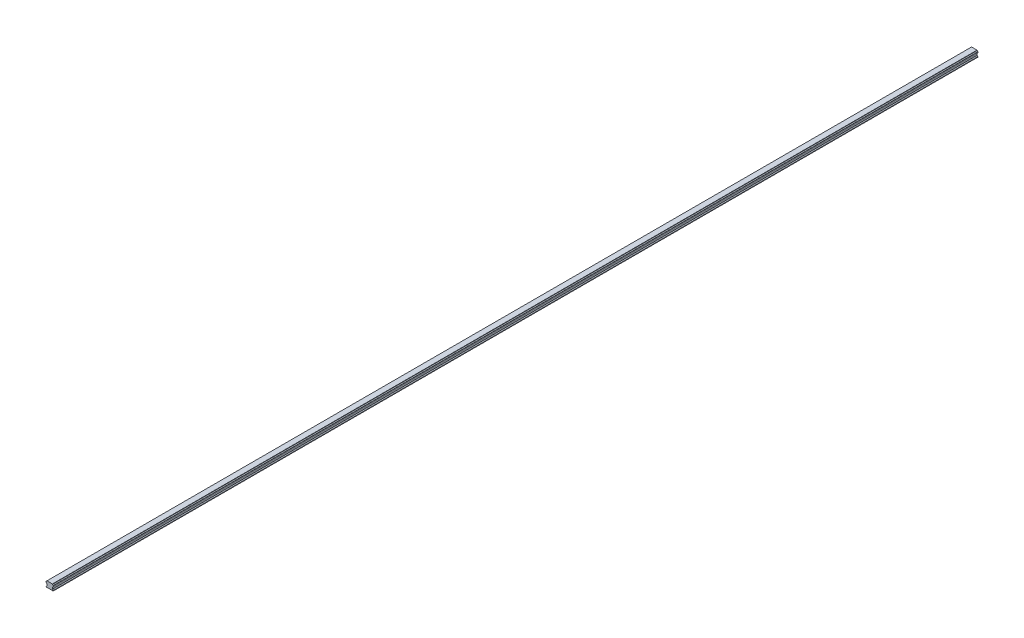
ISO-10303-21;
HEADER;
FILE_DESCRIPTION(('STEP AP214'),'2;1');
FILE_NAME('part.step','',(''),(''),'','','');
FILE_SCHEMA(('AUTOMOTIVE_DESIGN { 1 0 10303 214 1 1 1 1 }'));
ENDSEC;
DATA;
#1=APPLICATION_CONTEXT('core data for automotive mechanical design processes');
#2=APPLICATION_PROTOCOL_DEFINITION('international standard','automotive_design',2000,#1);
#3=PRODUCT_CONTEXT('',#1,'mechanical');
#4=PRODUCT('Part','Part','',(#3));
#5=PRODUCT_RELATED_PRODUCT_CATEGORY('part','',(#4));
#6=PRODUCT_DEFINITION_FORMATION('','',#4);
#7=PRODUCT_DEFINITION_CONTEXT('part definition',#1,'design');
#8=PRODUCT_DEFINITION('design','',#6,#7);
#9=PRODUCT_DEFINITION_SHAPE('','',#8);
#10=(LENGTH_UNIT() NAMED_UNIT(*) SI_UNIT(.MILLI.,.METRE.));
#11=(NAMED_UNIT(*) PLANE_ANGLE_UNIT() SI_UNIT($,.RADIAN.));
#12=(NAMED_UNIT(*) SI_UNIT($,.STERADIAN.) SOLID_ANGLE_UNIT());
#13=UNCERTAINTY_MEASURE_WITH_UNIT(LENGTH_MEASURE(1.E-05),#10,'distance_accuracy_value','');
#14=(GEOMETRIC_REPRESENTATION_CONTEXT(3) GLOBAL_UNCERTAINTY_ASSIGNED_CONTEXT((#13)) GLOBAL_UNIT_ASSIGNED_CONTEXT((#10,
#11,#12)) REPRESENTATION_CONTEXT('',''));
#15=CARTESIAN_POINT('',(0.,0.,0.));
#16=DIRECTION('',(0.,0.,1.));
#17=DIRECTION('',(1.,0.,0.));
#18=AXIS2_PLACEMENT_3D('',#15,#16,#17);
#19=CARTESIAN_POINT('',(12.6061123393257,-8.53589954229437,2900.));
#20=DIRECTION('',(0.,0.,-1.));
#21=DIRECTION('',(-1.,0.,0.));
#22=AXIS2_PLACEMENT_3D('',#19,#20,#21);
#23=CYLINDRICAL_SURFACE('',#22,2.52146686901217);
#24=CARTESIAN_POINT('',(12.6061123393257,-8.53589954229437,0.));
#25=DIRECTION('',(0.,0.,1.));
#26=DIRECTION('',(1.,0.,0.));
#27=AXIS2_PLACEMENT_3D('',#24,#25,#26);
#28=CIRCLE('',#27,2.52146686901217);
#29=CARTESIAN_POINT('',(12.4098510861146,-6.02208238664959,0.));
#30=VERTEX_POINT('',#29);
#31=CARTESIAN_POINT('',(10.0922951836809,-8.33963828908326,0.));
#32=VERTEX_POINT('',#31);
#33=EDGE_CURVE('E211',#30,#32,#28,.T.);
#34=ORIENTED_EDGE('',*,*,#33,.F.);
#35=DIRECTION('',(0.,0.,-1.));
#36=VECTOR('',#35,1.);
#37=CARTESIAN_POINT('',(12.4098510861146,-6.02208238664959,2900.));
#38=LINE('',#37,#36);
#39=CARTESIAN_POINT('',(12.4098510861146,-6.02208238664959,2900.));
#40=VERTEX_POINT('',#39);
#41=EDGE_CURVE('E11',#40,#30,#38,.T.);
#42=ORIENTED_EDGE('',*,*,#41,.F.);
#43=CARTESIAN_POINT('',(12.6061123393257,-8.53589954229437,2900.));
#44=DIRECTION('',(0.,0.,1.));
#45=DIRECTION('',(1.,0.,0.));
#46=AXIS2_PLACEMENT_3D('',#43,#44,#45);
#47=CIRCLE('',#46,2.52146686901217);
#48=CARTESIAN_POINT('',(10.0922951836809,-8.33963828908326,2900.));
#49=VERTEX_POINT('',#48);
#50=EDGE_CURVE('E271',#40,#49,#47,.T.);
#51=ORIENTED_EDGE('',*,*,#50,.T.);
#52=DIRECTION('',(0.,0.,-1.));
#53=VECTOR('',#52,1.);
#54=CARTESIAN_POINT('',(10.0922951836809,-8.33963828908326,2900.));
#55=LINE('',#54,#53);
#56=EDGE_CURVE('E51',#49,#32,#55,.T.);
#57=ORIENTED_EDGE('',*,*,#56,.T.);
#58=EDGE_LOOP('',(#34,#42,#51,#57));
#59=FACE_BOUND('',#58,.T.);
#60=ADVANCED_FACE('F35',(#59),#23,.F.);
#61=CARTESIAN_POINT('',(9.21596673638211,-9.21596673638211,2900.));
#62=DIRECTION('',(0.707106781186548,-0.707106781186548,0.));
#63=DIRECTION('',(0.707106781186548,0.707106781186548,0.));
#64=AXIS2_PLACEMENT_3D('',#61,#62,#63);
#65=PLANE('',#64);
#66=DIRECTION('',(-0.707106781186548,-0.707106781186548,0.));
#67=VECTOR('',#66,1.);
#68=CARTESIAN_POINT('',(9.21596673638211,-9.21596673638211,0.));
#69=LINE('',#68,#67);
#70=CARTESIAN_POINT('',(12.6061123393258,-5.82582113343842,0.));
#71=VERTEX_POINT('',#70);
#72=EDGE_CURVE('E213',#71,#30,#69,.T.);
#73=ORIENTED_EDGE('',*,*,#72,.F.);
#74=DIRECTION('',(0.,0.,-1.));
#75=VECTOR('',#74,1.);
#76=CARTESIAN_POINT('',(12.6061123393258,-5.82582113343842,2900.));
#77=LINE('',#76,#75);
#78=CARTESIAN_POINT('',(12.6061123393258,-5.82582113343842,2900.));
#79=VERTEX_POINT('',#78);
#80=EDGE_CURVE('E43',#79,#71,#77,.T.);
#81=ORIENTED_EDGE('',*,*,#80,.F.);
#82=DIRECTION('',(-0.707106781186548,-0.707106781186548,0.));
#83=VECTOR('',#82,1.);
#84=CARTESIAN_POINT('',(9.21596673638211,-9.21596673638211,2900.));
#85=LINE('',#84,#83);
#86=EDGE_CURVE('E330',#79,#40,#85,.T.);
#87=ORIENTED_EDGE('',*,*,#86,.T.);
#88=ORIENTED_EDGE('',*,*,#41,.T.);
#89=EDGE_LOOP('',(#73,#81,#87,#88));
#90=FACE_BOUND('',#89,.T.);
#91=ADVANCED_FACE('F318',(#90),#65,.T.);
#92=CARTESIAN_POINT('',(12.6061123393258,0.,2900.));
#93=DIRECTION('',(1.,0.,0.));
#94=DIRECTION('',(0.,0.,-1.));
#95=AXIS2_PLACEMENT_3D('',#92,#93,#94);
#96=PLANE('',#95);
#97=DIRECTION('',(0.,-1.,0.));
#98=VECTOR('',#97,1.);
#99=CARTESIAN_POINT('',(12.6061123393258,0.,0.));
#100=LINE('',#99,#98);
#101=CARTESIAN_POINT('',(12.6061123393258,-2.80006089062388,0.));
#102=VERTEX_POINT('',#101);
#103=EDGE_CURVE('E216',#102,#71,#100,.T.);
#104=ORIENTED_EDGE('',*,*,#103,.F.);
#105=DIRECTION('',(0.,0.,-1.));
#106=VECTOR('',#105,1.);
#107=CARTESIAN_POINT('',(12.6061123393258,-2.80006089062388,2900.));
#108=LINE('',#107,#106);
#109=CARTESIAN_POINT('',(12.6061123393258,-2.80006089062388,2900.));
#110=VERTEX_POINT('',#109);
#111=EDGE_CURVE('E307',#110,#102,#108,.T.);
#112=ORIENTED_EDGE('',*,*,#111,.F.);
#113=DIRECTION('',(0.,-1.,0.));
#114=VECTOR('',#113,1.);
#115=CARTESIAN_POINT('',(12.6061123393258,0.,2900.));
#116=LINE('',#115,#114);
#117=EDGE_CURVE('E314',#110,#79,#116,.T.);
#118=ORIENTED_EDGE('',*,*,#117,.T.);
#119=ORIENTED_EDGE('',*,*,#80,.T.);
#120=EDGE_LOOP('',(#104,#112,#118,#119));
#121=FACE_BOUND('',#120,.T.);
#122=ADVANCED_FACE('F312',(#121),#96,.T.);
#123=CARTESIAN_POINT('',(4.90302572435094,4.90302572435095,2900.));
#124=DIRECTION('',(0.707106781186547,0.707106781186548,0.));
#125=DIRECTION('',(-0.707106781186548,0.707106781186547,0.));
#126=AXIS2_PLACEMENT_3D('',#123,#124,#125);
#127=PLANE('',#126);
#128=DIRECTION('',(0.707106781186548,-0.707106781186547,0.));
#129=VECTOR('',#128,1.);
#130=CARTESIAN_POINT('',(4.90302572435094,4.90302572435095,0.));
#131=LINE('',#130,#129);
#132=CARTESIAN_POINT('',(12.4098510861147,-2.60379963741275,0.));
#133=VERTEX_POINT('',#132);
#134=EDGE_CURVE('E219',#133,#102,#131,.T.);
#135=ORIENTED_EDGE('',*,*,#134,.F.);
#136=DIRECTION('',(0.,0.,-1.));
#137=VECTOR('',#136,1.);
#138=CARTESIAN_POINT('',(12.4098510861147,-2.60379963741275,2900.));
#139=LINE('',#138,#137);
#140=CARTESIAN_POINT('',(12.4098510861147,-2.60379963741275,2900.));
#141=VERTEX_POINT('',#140);
#142=EDGE_CURVE('E305',#141,#133,#139,.T.);
#143=ORIENTED_EDGE('',*,*,#142,.F.);
#144=DIRECTION('',(0.707106781186548,-0.707106781186547,0.));
#145=VECTOR('',#144,1.);
#146=CARTESIAN_POINT('',(4.90302572435094,4.90302572435095,2900.));
#147=LINE('',#146,#145);
#148=EDGE_CURVE('E327',#141,#110,#147,.T.);
#149=ORIENTED_EDGE('',*,*,#148,.T.);
#150=ORIENTED_EDGE('',*,*,#111,.T.);
#151=EDGE_LOOP('',(#135,#143,#149,#150));
#152=FACE_BOUND('',#151,.T.);
#153=ADVANCED_FACE('F324',(#152),#127,.T.);
#154=CARTESIAN_POINT('',(12.6061123393258,-0.0899824817679875,2900.));
#155=DIRECTION('',(0.,0.,-1.));
#156=DIRECTION('',(-1.,0.,0.));
#157=AXIS2_PLACEMENT_3D('',#154,#155,#156);
#158=CYLINDRICAL_SURFACE('',#157,2.52146686901215);
#159=CARTESIAN_POINT('',(12.6061123393258,-0.0899824817679875,0.));
#160=DIRECTION('',(0.,0.,1.));
#161=DIRECTION('',(1.,0.,0.));
#162=AXIS2_PLACEMENT_3D('',#159,#160,#161);
#163=CIRCLE('',#162,2.52146686901215);
#164=CARTESIAN_POINT('',(10.092295183681,-0.286243734979242,0.));
#165=VERTEX_POINT('',#164);
#166=EDGE_CURVE('E222',#165,#133,#163,.T.);
#167=ORIENTED_EDGE('',*,*,#166,.F.);
#168=DIRECTION('',(0.,0.,-1.));
#169=VECTOR('',#168,1.);
#170=CARTESIAN_POINT('',(10.092295183681,-0.286243734979242,2900.));
#171=LINE('',#170,#169);
#172=CARTESIAN_POINT('',(10.092295183681,-0.286243734979242,2900.));
#173=VERTEX_POINT('',#172);
#174=EDGE_CURVE('E303',#173,#165,#171,.T.);
#175=ORIENTED_EDGE('',*,*,#174,.F.);
#176=CARTESIAN_POINT('',(12.6061123393258,-0.0899824817679875,2900.));
#177=DIRECTION('',(0.,0.,1.));
#178=DIRECTION('',(1.,0.,0.));
#179=AXIS2_PLACEMENT_3D('',#176,#177,#178);
#180=CIRCLE('',#179,2.52146686901215);
#181=EDGE_CURVE('E332',#173,#141,#180,.T.);
#182=ORIENTED_EDGE('',*,*,#181,.T.);
#183=ORIENTED_EDGE('',*,*,#142,.T.);
#184=EDGE_LOOP('',(#167,#175,#182,#183));
#185=FACE_BOUND('',#184,.T.);
#186=ADVANCED_FACE('F406',(#185),#158,.F.);
#187=CARTESIAN_POINT('',(4.90302572435088,4.9030257243509,2900.));
#188=DIRECTION('',(0.707106781186547,0.707106781186548,0.));
#189=DIRECTION('',(-0.707106781186548,0.707106781186547,0.));
#190=AXIS2_PLACEMENT_3D('',#187,#188,#189);
#191=PLANE('',#190);
#192=DIRECTION('',(0.707106781186548,-0.707106781186547,0.));
#193=VECTOR('',#192,1.);
#194=CARTESIAN_POINT('',(4.90302572435088,4.9030257243509,0.));
#195=LINE('',#194,#193);
#196=CARTESIAN_POINT('',(9.58035209651141,0.225699352190385,0.));
#197=VERTEX_POINT('',#196);
#198=EDGE_CURVE('E225',#197,#165,#195,.T.);
#199=ORIENTED_EDGE('',*,*,#198,.F.);
#200=DIRECTION('',(0.,0.,-1.));
#201=VECTOR('',#200,1.);
#202=CARTESIAN_POINT('',(9.58035209651141,0.225699352190385,2900.));
#203=LINE('',#202,#201);
#204=CARTESIAN_POINT('',(9.58035209651141,0.225699352190385,2900.));
#205=VERTEX_POINT('',#204);
#206=EDGE_CURVE('E301',#205,#197,#203,.T.);
#207=ORIENTED_EDGE('',*,*,#206,.F.);
#208=DIRECTION('',(0.707106781186548,-0.707106781186547,0.));
#209=VECTOR('',#208,1.);
#210=CARTESIAN_POINT('',(4.90302572435088,4.9030257243509,2900.));
#211=LINE('',#210,#209);
#212=EDGE_CURVE('E338',#205,#173,#211,.T.);
#213=ORIENTED_EDGE('',*,*,#212,.T.);
#214=ORIENTED_EDGE('',*,*,#174,.T.);
#215=EDGE_LOOP('',(#199,#207,#213,#214));
#216=FACE_BOUND('',#215,.T.);
#217=ADVANCED_FACE('F409',(#216),#191,.T.);
#218=CARTESIAN_POINT('',(0.,0.225699352190385,2900.));
#219=DIRECTION('',(0.,1.,0.));
#220=DIRECTION('',(0.,0.,1.));
#221=AXIS2_PLACEMENT_3D('',#218,#219,#220);
#222=PLANE('',#221);
#223=DIRECTION('',(1.,0.,0.));
#224=VECTOR('',#223,1.);
#225=CARTESIAN_POINT('',(0.,0.225699352190385,0.));
#226=LINE('',#225,#224);
#227=CARTESIAN_POINT('',(-7.56562261277197,0.225699352190385,0.));
#228=VERTEX_POINT('',#227);
#229=EDGE_CURVE('E228',#228,#197,#226,.T.);
#230=ORIENTED_EDGE('',*,*,#229,.F.);
#231=DIRECTION('',(0.,0.,-1.));
#232=VECTOR('',#231,1.);
#233=CARTESIAN_POINT('',(-7.56562261277197,0.225699352190385,2900.));
#234=LINE('',#233,#232);
#235=CARTESIAN_POINT('',(-7.56562261277197,0.225699352190385,2900.));
#236=VERTEX_POINT('',#235);
#237=EDGE_CURVE('E299',#236,#228,#234,.T.);
#238=ORIENTED_EDGE('',*,*,#237,.F.);
#239=DIRECTION('',(1.,0.,0.));
#240=VECTOR('',#239,1.);
#241=CARTESIAN_POINT('',(0.,0.225699352190385,2900.));
#242=LINE('',#241,#240);
#243=EDGE_CURVE('E341',#236,#205,#242,.T.);
#244=ORIENTED_EDGE('',*,*,#243,.T.);
#245=ORIENTED_EDGE('',*,*,#206,.T.);
#246=EDGE_LOOP('',(#230,#238,#244,#245));
#247=FACE_BOUND('',#246,.T.);
#248=ADVANCED_FACE('F413',(#247),#222,.T.);
#249=CARTESIAN_POINT('',(-3.8956609824812,3.89566098248118,2900.));
#250=DIRECTION('',(-0.70710678118655,0.707106781186546,0.));
#251=DIRECTION('',(-0.707106781186546,-0.70710678118655,0.));
#252=AXIS2_PLACEMENT_3D('',#249,#250,#251);
#253=PLANE('',#252);
#254=DIRECTION('',(0.707106781186546,0.707106781186549,0.));
#255=VECTOR('',#254,1.);
#256=CARTESIAN_POINT('',(-3.8956609824812,3.89566098248118,0.));
#257=LINE('',#256,#255);
#258=CARTESIAN_POINT('',(-8.07756569994197,-0.28624373497962,0.));
#259=VERTEX_POINT('',#258);
#260=EDGE_CURVE('E231',#259,#228,#257,.T.);
#261=ORIENTED_EDGE('',*,*,#260,.F.);
#262=DIRECTION('',(0.,0.,-1.));
#263=VECTOR('',#262,1.);
#264=CARTESIAN_POINT('',(-8.07756569994197,-0.28624373497962,2900.));
#265=LINE('',#264,#263);
#266=CARTESIAN_POINT('',(-8.07756569994197,-0.28624373497962,2900.));
#267=VERTEX_POINT('',#266);
#268=EDGE_CURVE('E297',#267,#259,#265,.T.);
#269=ORIENTED_EDGE('',*,*,#268,.F.);
#270=DIRECTION('',(0.707106781186546,0.707106781186549,0.));
#271=VECTOR('',#270,1.);
#272=CARTESIAN_POINT('',(-3.8956609824812,3.89566098248118,2900.));
#273=LINE('',#272,#271);
#274=EDGE_CURVE('E344',#267,#236,#273,.T.);
#275=ORIENTED_EDGE('',*,*,#274,.T.);
#276=ORIENTED_EDGE('',*,*,#237,.T.);
#277=EDGE_LOOP('',(#261,#269,#275,#276));
#278=FACE_BOUND('',#277,.T.);
#279=ADVANCED_FACE('F417',(#278),#253,.T.);
#280=CARTESIAN_POINT('',(-10.5913828555866,-0.0899824817683164,2900.));
#281=DIRECTION('',(0.,0.,-1.));
#282=DIRECTION('',(-1.,0.,0.));
#283=AXIS2_PLACEMENT_3D('',#280,#281,#282);
#284=CYLINDRICAL_SURFACE('',#283,2.521466869012);
#285=CARTESIAN_POINT('',(-10.5913828555866,-0.0899824817683164,0.));
#286=DIRECTION('',(0.,0.,1.));
#287=DIRECTION('',(1.,0.,0.));
#288=AXIS2_PLACEMENT_3D('',#285,#286,#287);
#289=CIRCLE('',#288,2.521466869012);
#290=CARTESIAN_POINT('',(-10.3951216023756,-2.60379963741295,0.));
#291=VERTEX_POINT('',#290);
#292=EDGE_CURVE('E234',#291,#259,#289,.T.);
#293=ORIENTED_EDGE('',*,*,#292,.F.);
#294=DIRECTION('',(0.,0.,-1.));
#295=VECTOR('',#294,1.);
#296=CARTESIAN_POINT('',(-10.3951216023756,-2.60379963741295,2900.));
#297=LINE('',#296,#295);
#298=CARTESIAN_POINT('',(-10.3951216023756,-2.60379963741295,2900.));
#299=VERTEX_POINT('',#298);
#300=EDGE_CURVE('E295',#299,#291,#297,.T.);
#301=ORIENTED_EDGE('',*,*,#300,.F.);
#302=CARTESIAN_POINT('',(-10.5913828555866,-0.0899824817683164,2900.));
#303=DIRECTION('',(0.,0.,1.));
#304=DIRECTION('',(1.,0.,0.));
#305=AXIS2_PLACEMENT_3D('',#302,#303,#304);
#306=CIRCLE('',#305,2.521466869012);
#307=EDGE_CURVE('E347',#299,#267,#306,.T.);
#308=ORIENTED_EDGE('',*,*,#307,.T.);
#309=ORIENTED_EDGE('',*,*,#268,.T.);
#310=EDGE_LOOP('',(#293,#301,#308,#309));
#311=FACE_BOUND('',#310,.T.);
#312=ADVANCED_FACE('F421',(#311),#284,.F.);
#313=CARTESIAN_POINT('',(-3.89566098248133,3.89566098248133,2900.));
#314=DIRECTION('',(-0.707106781186547,0.707106781186548,0.));
#315=DIRECTION('',(-0.707106781186548,-0.707106781186547,0.));
#316=AXIS2_PLACEMENT_3D('',#313,#314,#315);
#317=PLANE('',#316);
#318=DIRECTION('',(0.707106781186548,0.707106781186547,0.));
#319=VECTOR('',#318,1.);
#320=CARTESIAN_POINT('',(-3.89566098248133,3.89566098248133,0.));
#321=LINE('',#320,#319);
#322=CARTESIAN_POINT('',(-10.5913828555866,-2.8000608906239,0.));
#323=VERTEX_POINT('',#322);
#324=EDGE_CURVE('E237',#323,#291,#321,.T.);
#325=ORIENTED_EDGE('',*,*,#324,.F.);
#326=DIRECTION('',(0.,0.,-1.));
#327=VECTOR('',#326,1.);
#328=CARTESIAN_POINT('',(-10.5913828555866,-2.8000608906239,2900.));
#329=LINE('',#328,#327);
#330=CARTESIAN_POINT('',(-10.5913828555866,-2.8000608906239,2900.));
#331=VERTEX_POINT('',#330);
#332=EDGE_CURVE('E293',#331,#323,#329,.T.);
#333=ORIENTED_EDGE('',*,*,#332,.F.);
#334=DIRECTION('',(0.707106781186548,0.707106781186547,0.));
#335=VECTOR('',#334,1.);
#336=CARTESIAN_POINT('',(-3.89566098248133,3.89566098248133,2900.));
#337=LINE('',#336,#335);
#338=EDGE_CURVE('E350',#331,#299,#337,.T.);
#339=ORIENTED_EDGE('',*,*,#338,.T.);
#340=ORIENTED_EDGE('',*,*,#300,.T.);
#341=EDGE_LOOP('',(#325,#333,#339,#340));
#342=FACE_BOUND('',#341,.T.);
#343=ADVANCED_FACE('F425',(#342),#317,.T.);
#344=CARTESIAN_POINT('',(-10.5913828555866,0.,2900.));
#345=DIRECTION('',(-1.,0.,0.));
#346=DIRECTION('',(0.,0.,1.));
#347=AXIS2_PLACEMENT_3D('',#344,#345,#346);
#348=PLANE('',#347);
#349=DIRECTION('',(0.,1.,0.));
#350=VECTOR('',#349,1.);
#351=CARTESIAN_POINT('',(-10.5913828555866,0.,0.));
#352=LINE('',#351,#350);
#353=CARTESIAN_POINT('',(-10.5913828555866,-5.82582113343851,0.));
#354=VERTEX_POINT('',#353);
#355=EDGE_CURVE('E240',#354,#323,#352,.T.);
#356=ORIENTED_EDGE('',*,*,#355,.F.);
#357=DIRECTION('',(0.,0.,-1.));
#358=VECTOR('',#357,1.);
#359=CARTESIAN_POINT('',(-10.5913828555866,-5.82582113343851,2900.));
#360=LINE('',#359,#358);
#361=CARTESIAN_POINT('',(-10.5913828555866,-5.82582113343851,2900.));
#362=VERTEX_POINT('',#361);
#363=EDGE_CURVE('E291',#362,#354,#360,.T.);
#364=ORIENTED_EDGE('',*,*,#363,.F.);
#365=DIRECTION('',(0.,1.,0.));
#366=VECTOR('',#365,1.);
#367=CARTESIAN_POINT('',(-10.5913828555866,0.,2900.));
#368=LINE('',#367,#366);
#369=EDGE_CURVE('E353',#362,#331,#368,.T.);
#370=ORIENTED_EDGE('',*,*,#369,.T.);
#371=ORIENTED_EDGE('',*,*,#332,.T.);
#372=EDGE_LOOP('',(#356,#364,#370,#371));
#373=FACE_BOUND('',#372,.T.);
#374=ADVANCED_FACE('F429',(#373),#348,.T.);
#375=CARTESIAN_POINT('',(-8.20860199451251,-8.20860199451255,2900.));
#376=DIRECTION('',(-0.707106781186546,-0.707106781186549,0.));
#377=DIRECTION('',(0.707106781186549,-0.707106781186546,0.));
#378=AXIS2_PLACEMENT_3D('',#375,#376,#377);
#379=PLANE('',#378);
#380=DIRECTION('',(-0.707106781186549,0.707106781186546,0.));
#381=VECTOR('',#380,1.);
#382=CARTESIAN_POINT('',(-8.20860199451251,-8.20860199451255,0.));
#383=LINE('',#382,#381);
#384=CARTESIAN_POINT('',(-10.3951216023755,-6.02208238664962,0.));
#385=VERTEX_POINT('',#384);
#386=EDGE_CURVE('E243',#385,#354,#383,.T.);
#387=ORIENTED_EDGE('',*,*,#386,.F.);
#388=DIRECTION('',(0.,0.,-1.));
#389=VECTOR('',#388,1.);
#390=CARTESIAN_POINT('',(-10.3951216023755,-6.02208238664962,2900.));
#391=LINE('',#390,#389);
#392=CARTESIAN_POINT('',(-10.3951216023755,-6.02208238664962,2900.));
#393=VERTEX_POINT('',#392);
#394=EDGE_CURVE('E289',#393,#385,#391,.T.);
#395=ORIENTED_EDGE('',*,*,#394,.F.);
#396=DIRECTION('',(-0.707106781186549,0.707106781186546,0.));
#397=VECTOR('',#396,1.);
#398=CARTESIAN_POINT('',(-8.20860199451251,-8.20860199451255,2900.));
#399=LINE('',#398,#397);
#400=EDGE_CURVE('E356',#393,#362,#399,.T.);
#401=ORIENTED_EDGE('',*,*,#400,.T.);
#402=ORIENTED_EDGE('',*,*,#363,.T.);
#403=EDGE_LOOP('',(#387,#395,#401,#402));
#404=FACE_BOUND('',#403,.T.);
#405=ADVANCED_FACE('F433',(#404),#379,.T.);
#406=CARTESIAN_POINT('',(-10.5913828555866,-8.5358995422944,2900.));
#407=DIRECTION('',(0.,0.,-1.));
#408=DIRECTION('',(-1.,0.,0.));
#409=AXIS2_PLACEMENT_3D('',#406,#407,#408);
#410=CYLINDRICAL_SURFACE('',#409,2.52146686901217);
#411=CARTESIAN_POINT('',(-10.5913828555866,-8.5358995422944,0.));
#412=DIRECTION('',(0.,0.,1.));
#413=DIRECTION('',(1.,0.,0.));
#414=AXIS2_PLACEMENT_3D('',#411,#412,#413);
#415=CIRCLE('',#414,2.52146686901217);
#416=CARTESIAN_POINT('',(-8.07756569994179,-8.33963828908329,0.));
#417=VERTEX_POINT('',#416);
#418=EDGE_CURVE('E246',#417,#385,#415,.T.);
#419=ORIENTED_EDGE('',*,*,#418,.F.);
#420=DIRECTION('',(0.,0.,-1.));
#421=VECTOR('',#420,1.);
#422=CARTESIAN_POINT('',(-8.07756569994179,-8.33963828908329,2900.));
#423=LINE('',#422,#421);
#424=CARTESIAN_POINT('',(-8.07756569994179,-8.33963828908329,2900.));
#425=VERTEX_POINT('',#424);
#426=EDGE_CURVE('E287',#425,#417,#423,.T.);
#427=ORIENTED_EDGE('',*,*,#426,.F.);
#428=CARTESIAN_POINT('',(-10.5913828555866,-8.5358995422944,2900.));
#429=DIRECTION('',(0.,0.,1.));
#430=DIRECTION('',(1.,0.,0.));
#431=AXIS2_PLACEMENT_3D('',#428,#429,#430);
#432=CIRCLE('',#431,2.52146686901217);
#433=EDGE_CURVE('E359',#425,#393,#432,.T.);
#434=ORIENTED_EDGE('',*,*,#433,.T.);
#435=ORIENTED_EDGE('',*,*,#394,.T.);
#436=EDGE_LOOP('',(#419,#427,#434,#435));
#437=FACE_BOUND('',#436,.T.);
#438=ADVANCED_FACE('F437',(#437),#410,.F.);
#439=CARTESIAN_POINT('',(-8.20860199451252,-8.20860199451256,2900.));
#440=DIRECTION('',(-0.707106781186546,-0.707106781186549,0.));
#441=DIRECTION('',(0.707106781186549,-0.707106781186546,0.));
#442=AXIS2_PLACEMENT_3D('',#439,#440,#441);
#443=PLANE('',#442);
#444=DIRECTION('',(-0.707106781186549,0.707106781186546,0.));
#445=VECTOR('',#444,1.);
#446=CARTESIAN_POINT('',(-8.20860199451252,-8.20860199451256,0.));
#447=LINE('',#446,#445);
#448=CARTESIAN_POINT('',(-7.56562261277186,-8.85158137625322,0.));
#449=VERTEX_POINT('',#448);
#450=EDGE_CURVE('E249',#449,#417,#447,.T.);
#451=ORIENTED_EDGE('',*,*,#450,.F.);
#452=DIRECTION('',(0.,0.,-1.));
#453=VECTOR('',#452,1.);
#454=CARTESIAN_POINT('',(-7.56562261277186,-8.85158137625322,2900.));
#455=LINE('',#454,#453);
#456=CARTESIAN_POINT('',(-7.56562261277186,-8.85158137625322,2900.));
#457=VERTEX_POINT('',#456);
#458=EDGE_CURVE('E285',#457,#449,#455,.T.);
#459=ORIENTED_EDGE('',*,*,#458,.F.);
#460=DIRECTION('',(-0.707106781186549,0.707106781186546,0.));
#461=VECTOR('',#460,1.);
#462=CARTESIAN_POINT('',(-8.20860199451252,-8.20860199451256,2900.));
#463=LINE('',#462,#461);
#464=EDGE_CURVE('E362',#457,#425,#463,.T.);
#465=ORIENTED_EDGE('',*,*,#464,.T.);
#466=ORIENTED_EDGE('',*,*,#426,.T.);
#467=EDGE_LOOP('',(#451,#459,#465,#466));
#468=FACE_BOUND('',#467,.T.);
#469=ADVANCED_FACE('F441',(#468),#443,.T.);
#470=CARTESIAN_POINT('',(-7.56562261277186,0.,2900.));
#471=DIRECTION('',(-1.,0.,0.));
#472=DIRECTION('',(0.,0.,1.));
#473=AXIS2_PLACEMENT_3D('',#470,#471,#472);
#474=PLANE('',#473);
#475=DIRECTION('',(0.,1.,0.));
#476=VECTOR('',#475,1.);
#477=CARTESIAN_POINT('',(-7.56562261277186,0.,0.));
#478=LINE('',#477,#476);
#479=CARTESIAN_POINT('',(-7.56562261277186,-13.8945151142775,0.));
#480=VERTEX_POINT('',#479);
#481=EDGE_CURVE('E252',#480,#449,#478,.T.);
#482=ORIENTED_EDGE('',*,*,#481,.F.);
#483=DIRECTION('',(0.,0.,-1.));
#484=VECTOR('',#483,1.);
#485=CARTESIAN_POINT('',(-7.56562261277186,-13.8945151142775,2900.));
#486=LINE('',#485,#484);
#487=CARTESIAN_POINT('',(-7.56562261277186,-13.8945151142775,2900.));
#488=VERTEX_POINT('',#487);
#489=EDGE_CURVE('E283',#488,#480,#486,.T.);
#490=ORIENTED_EDGE('',*,*,#489,.F.);
#491=DIRECTION('',(0.,1.,0.));
#492=VECTOR('',#491,1.);
#493=CARTESIAN_POINT('',(-7.56562261277186,0.,2900.));
#494=LINE('',#493,#492);
#495=EDGE_CURVE('E365',#488,#457,#494,.T.);
#496=ORIENTED_EDGE('',*,*,#495,.T.);
#497=ORIENTED_EDGE('',*,*,#458,.T.);
#498=EDGE_LOOP('',(#482,#490,#496,#497));
#499=FACE_BOUND('',#498,.T.);
#500=ADVANCED_FACE('F445',(#499),#474,.T.);
#501=CARTESIAN_POINT('',(3.16444625075283,-3.16444625075283,2900.));
#502=DIRECTION('',(-0.707106781186547,0.707106781186548,0.));
#503=DIRECTION('',(-0.707106781186548,-0.707106781186547,0.));
#504=AXIS2_PLACEMENT_3D('',#501,#502,#503);
#505=PLANE('',#504);
#506=DIRECTION('',(0.707106781186548,0.707106781186547,0.));
#507=VECTOR('',#506,1.);
#508=CARTESIAN_POINT('',(3.16444625075283,-3.16444625075283,0.));
#509=LINE('',#508,#507);
#510=CARTESIAN_POINT('',(-10.087089481784,-16.4159819832897,0.));
#511=VERTEX_POINT('',#510);
#512=EDGE_CURVE('E255',#511,#480,#509,.T.);
#513=ORIENTED_EDGE('',*,*,#512,.F.);
#514=DIRECTION('',(0.,0.,-1.));
#515=VECTOR('',#514,1.);
#516=CARTESIAN_POINT('',(-10.087089481784,-16.4159819832897,2900.));
#517=LINE('',#516,#515);
#518=CARTESIAN_POINT('',(-10.087089481784,-16.4159819832897,2900.));
#519=VERTEX_POINT('',#518);
#520=EDGE_CURVE('E281',#519,#511,#517,.T.);
#521=ORIENTED_EDGE('',*,*,#520,.F.);
#522=DIRECTION('',(0.707106781186548,0.707106781186547,0.));
#523=VECTOR('',#522,1.);
#524=CARTESIAN_POINT('',(3.16444625075283,-3.16444625075283,2900.));
#525=LINE('',#524,#523);
#526=EDGE_CURVE('E368',#519,#488,#525,.T.);
#527=ORIENTED_EDGE('',*,*,#526,.T.);
#528=ORIENTED_EDGE('',*,*,#489,.T.);
#529=EDGE_LOOP('',(#513,#521,#527,#528));
#530=FACE_BOUND('',#529,.T.);
#531=ADVANCED_FACE('F449',(#530),#505,.T.);
#532=CARTESIAN_POINT('',(-10.087089481784,0.,2900.));
#533=DIRECTION('',(1.,0.,0.));
#534=DIRECTION('',(0.,0.,-1.));
#535=AXIS2_PLACEMENT_3D('',#532,#533,#534);
#536=PLANE('',#535);
#537=DIRECTION('',(0.,-1.,0.));
#538=VECTOR('',#537,1.);
#539=CARTESIAN_POINT('',(-10.087089481784,0.,0.));
#540=LINE('',#539,#538);
#541=CARTESIAN_POINT('',(-10.087089481784,-17.7743006478096,0.));
#542=VERTEX_POINT('',#541);
#543=EDGE_CURVE('E258',#511,#542,#540,.T.);
#544=ORIENTED_EDGE('',*,*,#543,.T.);
#545=DIRECTION('',(0.,0.,-1.));
#546=VECTOR('',#545,1.);
#547=CARTESIAN_POINT('',(-10.087089481784,-17.7743006478096,2900.));
#548=LINE('',#547,#546);
#549=CARTESIAN_POINT('',(-10.087089481784,-17.7743006478096,2900.));
#550=VERTEX_POINT('',#549);
#551=EDGE_CURVE('E278',#550,#542,#548,.T.);
#552=ORIENTED_EDGE('',*,*,#551,.F.);
#553=DIRECTION('',(0.,-1.,0.));
#554=VECTOR('',#553,1.);
#555=CARTESIAN_POINT('',(-10.087089481784,0.,2900.));
#556=LINE('',#555,#554);
#557=EDGE_CURVE('E371',#519,#550,#556,.T.);
#558=ORIENTED_EDGE('',*,*,#557,.F.);
#559=ORIENTED_EDGE('',*,*,#520,.T.);
#560=EDGE_LOOP('',(#544,#552,#558,#559));
#561=FACE_BOUND('',#560,.T.);
#562=ADVANCED_FACE('F453',(#561),#536,.F.);
#563=CARTESIAN_POINT('',(0.,-17.7743006478096,2900.));
#564=DIRECTION('',(0.,1.,0.));
#565=DIRECTION('',(0.,0.,1.));
#566=AXIS2_PLACEMENT_3D('',#563,#564,#565);
#567=PLANE('',#566);
#568=DIRECTION('',(1.,0.,0.));
#569=VECTOR('',#568,1.);
#570=CARTESIAN_POINT('',(0.,-17.7743006478096,0.));
#571=LINE('',#570,#569);
#572=CARTESIAN_POINT('',(12.1018189655234,-17.7743006478096,0.));
#573=VERTEX_POINT('',#572);
#574=EDGE_CURVE('E260',#542,#573,#571,.T.);
#575=ORIENTED_EDGE('',*,*,#574,.T.);
#576=DIRECTION('',(0.,0.,-1.));
#577=VECTOR('',#576,1.);
#578=CARTESIAN_POINT('',(12.1018189655234,-17.7743006478096,2900.));
#579=LINE('',#578,#577);
#580=CARTESIAN_POINT('',(12.1018189655234,-17.7743006478096,2900.));
#581=VERTEX_POINT('',#580);
#582=EDGE_CURVE('E275',#581,#573,#579,.T.);
#583=ORIENTED_EDGE('',*,*,#582,.F.);
#584=DIRECTION('',(1.,0.,0.));
#585=VECTOR('',#584,1.);
#586=CARTESIAN_POINT('',(0.,-17.7743006478096,2900.));
#587=LINE('',#586,#585);
#588=EDGE_CURVE('E373',#550,#581,#587,.T.);
#589=ORIENTED_EDGE('',*,*,#588,.F.);
#590=ORIENTED_EDGE('',*,*,#551,.T.);
#591=EDGE_LOOP('',(#575,#583,#589,#590));
#592=FACE_BOUND('',#591,.T.);
#593=ADVANCED_FACE('F380',(#592),#567,.F.);
#594=CARTESIAN_POINT('',(12.1018189655234,0.,2900.));
#595=DIRECTION('',(-1.,0.,0.));
#596=DIRECTION('',(0.,0.,1.));
#597=AXIS2_PLACEMENT_3D('',#594,#595,#596);
#598=PLANE('',#597);
#599=DIRECTION('',(0.,1.,0.));
#600=VECTOR('',#599,1.);
#601=CARTESIAN_POINT('',(12.1018189655234,0.,0.));
#602=LINE('',#601,#600);
#603=CARTESIAN_POINT('',(12.1018189655234,-16.4159819832895,0.));
#604=VERTEX_POINT('',#603);
#605=EDGE_CURVE('E262',#573,#604,#602,.T.);
#606=ORIENTED_EDGE('',*,*,#605,.T.);
#607=DIRECTION('',(0.,0.,-1.));
#608=VECTOR('',#607,1.);
#609=CARTESIAN_POINT('',(12.1018189655234,-16.4159819832895,2900.));
#610=LINE('',#609,#608);
#611=CARTESIAN_POINT('',(12.1018189655234,-16.4159819832895,2900.));
#612=VERTEX_POINT('',#611);
#613=EDGE_CURVE('E194',#612,#604,#610,.T.);
#614=ORIENTED_EDGE('',*,*,#613,.F.);
#615=DIRECTION('',(0.,1.,0.));
#616=VECTOR('',#615,1.);
#617=CARTESIAN_POINT('',(12.1018189655234,0.,2900.));
#618=LINE('',#617,#616);
#619=EDGE_CURVE('E202',#581,#612,#618,.T.);
#620=ORIENTED_EDGE('',*,*,#619,.F.);
#621=ORIENTED_EDGE('',*,*,#582,.T.);
#622=EDGE_LOOP('',(#606,#614,#620,#621));
#623=FACE_BOUND('',#622,.T.);
#624=ADVANCED_FACE('F384',(#623),#598,.F.);
#625=CARTESIAN_POINT('',(-2.15708150888309,-2.15708150888309,2900.));
#626=DIRECTION('',(0.707106781186548,0.707106781186547,0.));
#627=DIRECTION('',(-0.707106781186547,0.707106781186548,0.));
#628=AXIS2_PLACEMENT_3D('',#625,#626,#627);
#629=PLANE('',#628);
#630=DIRECTION('',(0.707106781186547,-0.707106781186548,0.));
#631=VECTOR('',#630,1.);
#632=CARTESIAN_POINT('',(-2.15708150888309,-2.15708150888309,0.));
#633=LINE('',#632,#631);
#634=CARTESIAN_POINT('',(9.58035209651113,-13.8945151142773,0.));
#635=VERTEX_POINT('',#634);
#636=EDGE_CURVE('E190',#635,#604,#633,.T.);
#637=ORIENTED_EDGE('',*,*,#636,.F.);
#638=DIRECTION('',(0.,0.,-1.));
#639=VECTOR('',#638,1.);
#640=CARTESIAN_POINT('',(9.58035209651113,-13.8945151142773,2900.));
#641=LINE('',#640,#639);
#642=CARTESIAN_POINT('',(9.58035209651113,-13.8945151142773,2900.));
#643=VERTEX_POINT('',#642);
#644=EDGE_CURVE('E185',#643,#635,#641,.T.);
#645=ORIENTED_EDGE('',*,*,#644,.F.);
#646=DIRECTION('',(0.707106781186547,-0.707106781186548,0.));
#647=VECTOR('',#646,1.);
#648=CARTESIAN_POINT('',(-2.15708150888309,-2.15708150888309,2900.));
#649=LINE('',#648,#647);
#650=EDGE_CURVE('E188',#643,#612,#649,.T.);
#651=ORIENTED_EDGE('',*,*,#650,.T.);
#652=ORIENTED_EDGE('',*,*,#613,.T.);
#653=EDGE_LOOP('',(#637,#645,#651,#652));
#654=FACE_BOUND('',#653,.T.);
#655=ADVANCED_FACE('F187',(#654),#629,.T.);
#656=CARTESIAN_POINT('',(9.58035209651113,0.,2900.));
#657=DIRECTION('',(1.,0.,0.));
#658=DIRECTION('',(0.,0.,-1.));
#659=AXIS2_PLACEMENT_3D('',#656,#657,#658);
#660=PLANE('',#659);
#661=DIRECTION('',(0.,-1.,0.));
#662=VECTOR('',#661,1.);
#663=CARTESIAN_POINT('',(9.58035209651113,0.,0.));
#664=LINE('',#663,#662);
#665=CARTESIAN_POINT('',(9.58035209651113,-8.85158137625308,0.));
#666=VERTEX_POINT('',#665);
#667=EDGE_CURVE('E266',#666,#635,#664,.T.);
#668=ORIENTED_EDGE('',*,*,#667,.F.);
#669=DIRECTION('',(0.,0.,-1.));
#670=VECTOR('',#669,1.);
#671=CARTESIAN_POINT('',(9.58035209651113,-8.85158137625308,2900.));
#672=LINE('',#671,#670);
#673=CARTESIAN_POINT('',(9.58035209651113,-8.85158137625308,2900.));
#674=VERTEX_POINT('',#673);
#675=EDGE_CURVE('E118',#674,#666,#672,.T.);
#676=ORIENTED_EDGE('',*,*,#675,.F.);
#677=DIRECTION('',(0.,-1.,0.));
#678=VECTOR('',#677,1.);
#679=CARTESIAN_POINT('',(9.58035209651113,0.,2900.));
#680=LINE('',#679,#678);
#681=EDGE_CURVE('E200',#674,#643,#680,.T.);
#682=ORIENTED_EDGE('',*,*,#681,.T.);
#683=ORIENTED_EDGE('',*,*,#644,.T.);
#684=EDGE_LOOP('',(#668,#676,#682,#683));
#685=FACE_BOUND('',#684,.T.);
#686=ADVANCED_FACE('F205',(#685),#660,.T.);
#687=CARTESIAN_POINT('',(9.21596673638212,-9.21596673638209,2900.));
#688=DIRECTION('',(0.707106781186549,-0.707106781186546,0.));
#689=DIRECTION('',(0.707106781186546,0.707106781186549,0.));
#690=AXIS2_PLACEMENT_3D('',#687,#688,#689);
#691=PLANE('',#690);
#692=DIRECTION('',(-0.707106781186546,-0.707106781186549,0.));
#693=VECTOR('',#692,1.);
#694=CARTESIAN_POINT('',(9.21596673638212,-9.21596673638209,0.));
#695=LINE('',#694,#693);
#696=EDGE_CURVE('E268',#32,#666,#695,.T.);
#697=ORIENTED_EDGE('',*,*,#696,.F.);
#698=ORIENTED_EDGE('',*,*,#56,.F.);
#699=DIRECTION('',(-0.707106781186546,-0.707106781186549,0.));
#700=VECTOR('',#699,1.);
#701=CARTESIAN_POINT('',(9.21596673638212,-9.21596673638209,2900.));
#702=LINE('',#701,#700);
#703=EDGE_CURVE('E206',#49,#674,#702,.T.);
#704=ORIENTED_EDGE('',*,*,#703,.T.);
#705=ORIENTED_EDGE('',*,*,#675,.T.);
#706=EDGE_LOOP('',(#697,#698,#704,#705));
#707=FACE_BOUND('',#706,.T.);
#708=ADVANCED_FACE('F385',(#707),#691,.T.);
#709=CARTESIAN_POINT('',(0.,0.,2900.));
#710=DIRECTION('',(0.,0.,1.));
#711=DIRECTION('',(1.,0.,0.));
#712=AXIS2_PLACEMENT_3D('',#709,#710,#711);
#713=PLANE('',#712);
#714=ORIENTED_EDGE('',*,*,#50,.F.);
#715=ORIENTED_EDGE('',*,*,#86,.F.);
#716=ORIENTED_EDGE('',*,*,#117,.F.);
#717=ORIENTED_EDGE('',*,*,#148,.F.);
#718=ORIENTED_EDGE('',*,*,#181,.F.);
#719=ORIENTED_EDGE('',*,*,#212,.F.);
#720=ORIENTED_EDGE('',*,*,#243,.F.);
#721=ORIENTED_EDGE('',*,*,#274,.F.);
#722=ORIENTED_EDGE('',*,*,#307,.F.);
#723=ORIENTED_EDGE('',*,*,#338,.F.);
#724=ORIENTED_EDGE('',*,*,#369,.F.);
#725=ORIENTED_EDGE('',*,*,#400,.F.);
#726=ORIENTED_EDGE('',*,*,#433,.F.);
#727=ORIENTED_EDGE('',*,*,#464,.F.);
#728=ORIENTED_EDGE('',*,*,#495,.F.);
#729=ORIENTED_EDGE('',*,*,#526,.F.);
#730=ORIENTED_EDGE('',*,*,#557,.T.);
#731=ORIENTED_EDGE('',*,*,#588,.T.);
#732=ORIENTED_EDGE('',*,*,#619,.T.);
#733=ORIENTED_EDGE('',*,*,#650,.F.);
#734=ORIENTED_EDGE('',*,*,#681,.F.);
#735=ORIENTED_EDGE('',*,*,#703,.F.);
#736=EDGE_LOOP('',(#714,#715,#716,#717,#718,#719,#720,#721,#722,#723,#724,#725,#726,#727,#728,
#729,#730,#731,#732,#733,#734,#735));
#737=FACE_BOUND('',#736,.T.);
#738=ADVANCED_FACE('F198',(#737),#713,.T.);
#739=CARTESIAN_POINT('',(0.,0.,0.));
#740=DIRECTION('',(0.,0.,1.));
#741=DIRECTION('',(1.,0.,0.));
#742=AXIS2_PLACEMENT_3D('',#739,#740,#741);
#743=PLANE('',#742);
#744=ORIENTED_EDGE('',*,*,#33,.T.);
#745=ORIENTED_EDGE('',*,*,#696,.T.);
#746=ORIENTED_EDGE('',*,*,#667,.T.);
#747=ORIENTED_EDGE('',*,*,#636,.T.);
#748=ORIENTED_EDGE('',*,*,#605,.F.);
#749=ORIENTED_EDGE('',*,*,#574,.F.);
#750=ORIENTED_EDGE('',*,*,#543,.F.);
#751=ORIENTED_EDGE('',*,*,#512,.T.);
#752=ORIENTED_EDGE('',*,*,#481,.T.);
#753=ORIENTED_EDGE('',*,*,#450,.T.);
#754=ORIENTED_EDGE('',*,*,#418,.T.);
#755=ORIENTED_EDGE('',*,*,#386,.T.);
#756=ORIENTED_EDGE('',*,*,#355,.T.);
#757=ORIENTED_EDGE('',*,*,#324,.T.);
#758=ORIENTED_EDGE('',*,*,#292,.T.);
#759=ORIENTED_EDGE('',*,*,#260,.T.);
#760=ORIENTED_EDGE('',*,*,#229,.T.);
#761=ORIENTED_EDGE('',*,*,#198,.T.);
#762=ORIENTED_EDGE('',*,*,#166,.T.);
#763=ORIENTED_EDGE('',*,*,#134,.T.);
#764=ORIENTED_EDGE('',*,*,#103,.T.);
#765=ORIENTED_EDGE('',*,*,#72,.T.);
#766=EDGE_LOOP('',(#744,#745,#746,#747,#748,#749,#750,#751,#752,#753,#754,#755,#756,#757,#758,
#759,#760,#761,#762,#763,#764,#765));
#767=FACE_BOUND('',#766,.T.);
#768=ADVANCED_FACE('F320',(#767),#743,.F.);
#769=CLOSED_SHELL('',(#60,#91,#122,#153,#186,#217,#248,#279,#312,#343,#374,#405,#438,#469,#500,
#531,#562,#593,#624,#655,#686,#708,#738,#768));
#770=MANIFOLD_SOLID_BREP('B2',#769);
#771=ADVANCED_BREP_SHAPE_REPRESENTATION('',(#18,#770),#14);
#772=SHAPE_DEFINITION_REPRESENTATION(#9,#771);
ENDSEC;
END-ISO-10303-21;
